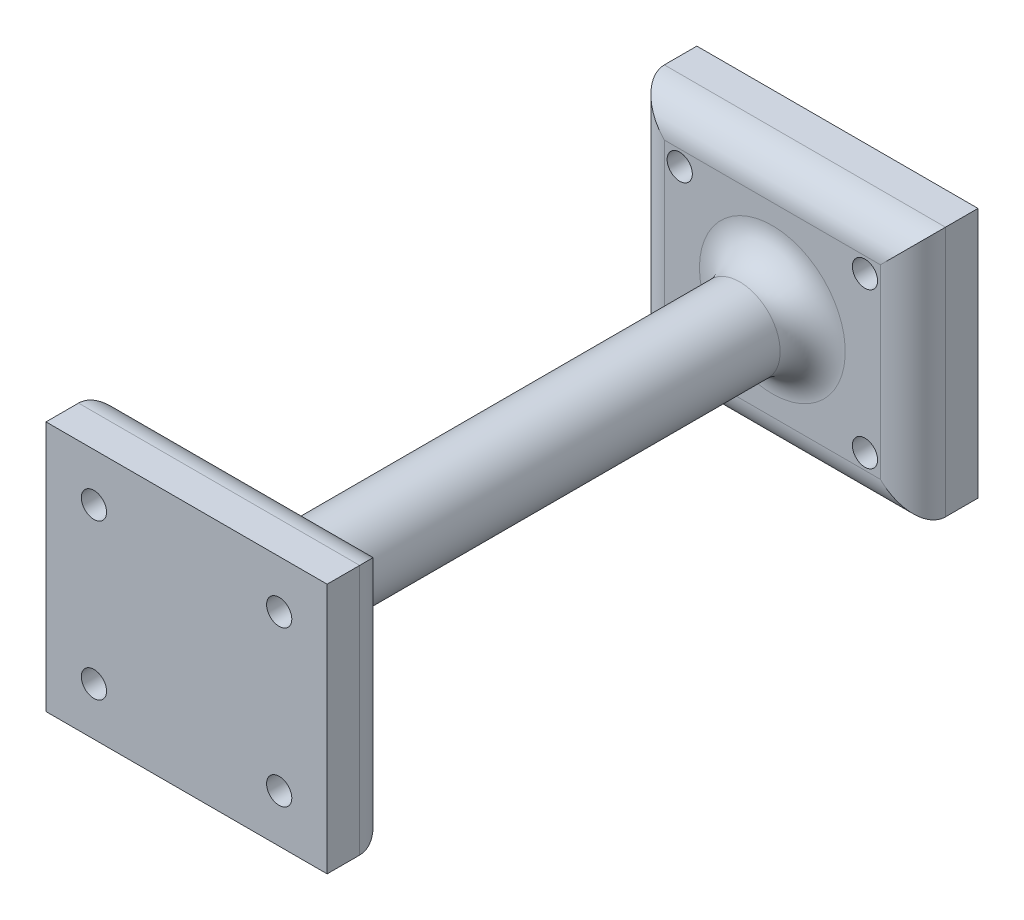
ISO-10303-21;
HEADER;
FILE_DESCRIPTION(('STEP AP214'),'2;1');
FILE_NAME('part.step','',(''),(''),'','','');
FILE_SCHEMA(('AUTOMOTIVE_DESIGN { 1 0 10303 214 1 1 1 1 }'));
ENDSEC;
DATA;
#1=APPLICATION_CONTEXT('core data for automotive mechanical design processes');
#2=APPLICATION_PROTOCOL_DEFINITION('international standard','automotive_design',2000,#1);
#3=PRODUCT_CONTEXT('',#1,'mechanical');
#4=PRODUCT('Part','Part','',(#3));
#5=PRODUCT_RELATED_PRODUCT_CATEGORY('part','',(#4));
#6=PRODUCT_DEFINITION_FORMATION('','',#4);
#7=PRODUCT_DEFINITION_CONTEXT('part definition',#1,'design');
#8=PRODUCT_DEFINITION('design','',#6,#7);
#9=PRODUCT_DEFINITION_SHAPE('','',#8);
#10=(LENGTH_UNIT() NAMED_UNIT(*) SI_UNIT(.MILLI.,.METRE.));
#11=(NAMED_UNIT(*) PLANE_ANGLE_UNIT() SI_UNIT($,.RADIAN.));
#12=(NAMED_UNIT(*) SI_UNIT($,.STERADIAN.) SOLID_ANGLE_UNIT());
#13=UNCERTAINTY_MEASURE_WITH_UNIT(LENGTH_MEASURE(1.E-05),#10,'distance_accuracy_value','');
#14=(GEOMETRIC_REPRESENTATION_CONTEXT(3) GLOBAL_UNCERTAINTY_ASSIGNED_CONTEXT((#13)) GLOBAL_UNIT_ASSIGNED_CONTEXT((#10,
#11,#12)) REPRESENTATION_CONTEXT('',''));
#15=CARTESIAN_POINT('',(0.,0.,0.));
#16=DIRECTION('',(0.,0.,1.));
#17=DIRECTION('',(1.,0.,0.));
#18=AXIS2_PLACEMENT_3D('',#15,#16,#17);
#19=CARTESIAN_POINT('',(-70.1135473442374,-293.286212021238,89.9999999999998));
#20=DIRECTION('',(0.,1.,0.));
#21=DIRECTION('',(0.,0.,1.));
#22=AXIS2_PLACEMENT_3D('',#19,#20,#21);
#23=PLANE('',#22);
#24=DIRECTION('',(0.,0.,1.));
#25=VECTOR('',#24,1.);
#26=CARTESIAN_POINT('',(-113.30674873975,-293.286212021238,90.));
#27=LINE('',#26,#25);
#28=CARTESIAN_POINT('',(-113.30674873975,-293.286212021238,95.));
#29=VERTEX_POINT('',#28);
#30=CARTESIAN_POINT('',(-113.30674873975,-293.286212021238,99.9999999999999));
#31=VERTEX_POINT('',#30);
#32=EDGE_CURVE('E98',#29,#31,#27,.T.);
#33=ORIENTED_EDGE('',*,*,#32,.F.);
#34=DIRECTION('',(-1.,0.,0.));
#35=VECTOR('',#34,1.);
#36=CARTESIAN_POINT('',(-70.1135473442374,-293.286212021238,94.9999999999998));
#37=LINE('',#36,#35);
#38=CARTESIAN_POINT('',(-70.1135473442374,-293.286212021238,94.9999999999998));
#39=VERTEX_POINT('',#38);
#40=EDGE_CURVE('E144',#29,#39,#37,.F.);
#41=ORIENTED_EDGE('',*,*,#40,.T.);
#42=DIRECTION('',(0.,0.,1.));
#43=VECTOR('',#42,1.);
#44=CARTESIAN_POINT('',(-70.1135473442374,-293.286212021238,89.9999999999998));
#45=LINE('',#44,#43);
#46=CARTESIAN_POINT('',(-70.1135473442373,-293.286212021238,99.9999999999998));
#47=VERTEX_POINT('',#46);
#48=EDGE_CURVE('E120',#39,#47,#45,.T.);
#49=ORIENTED_EDGE('',*,*,#48,.T.);
#50=DIRECTION('',(-1.,0.,0.));
#51=VECTOR('',#50,1.);
#52=CARTESIAN_POINT('',(-70.1135473442373,-293.286212021238,99.9999999999998));
#53=LINE('',#52,#51);
#54=EDGE_CURVE('E116',#47,#31,#53,.T.);
#55=ORIENTED_EDGE('',*,*,#54,.T.);
#56=EDGE_LOOP('',(#33,#41,#49,#55));
#57=FACE_BOUND('',#56,.T.);
#58=ADVANCED_FACE('F45',(#57),#23,.F.);
#59=CARTESIAN_POINT('',(-113.30674873975,-293.286212021238,90.));
#60=DIRECTION('',(1.,0.,0.));
#61=DIRECTION('',(0.,0.,-1.));
#62=AXIS2_PLACEMENT_3D('',#59,#60,#61);
#63=PLANE('',#62);
#64=DIRECTION('',(0.,0.,1.));
#65=VECTOR('',#64,1.);
#66=CARTESIAN_POINT('',(-113.30674873975,-254.735493102494,89.9999999999998));
#67=LINE('',#66,#65);
#68=CARTESIAN_POINT('',(-113.30674873975,-254.735493102494,94.9999999999998));
#69=VERTEX_POINT('',#68);
#70=CARTESIAN_POINT('',(-113.30674873975,-254.735493102493,99.9999999999998));
#71=VERTEX_POINT('',#70);
#72=EDGE_CURVE('E110',#69,#71,#67,.T.);
#73=ORIENTED_EDGE('',*,*,#72,.F.);
#74=DIRECTION('',(0.,1.,0.));
#75=VECTOR('',#74,1.);
#76=CARTESIAN_POINT('',(-113.30674873975,-293.286212021238,95.));
#77=LINE('',#76,#75);
#78=EDGE_CURVE('E104',#69,#29,#77,.F.);
#79=ORIENTED_EDGE('',*,*,#78,.T.);
#80=ORIENTED_EDGE('',*,*,#32,.T.);
#81=DIRECTION('',(0.,1.,0.));
#82=VECTOR('',#81,1.);
#83=CARTESIAN_POINT('',(-113.30674873975,-293.286212021238,99.9999999999999));
#84=LINE('',#83,#82);
#85=EDGE_CURVE('E101',#31,#71,#84,.T.);
#86=ORIENTED_EDGE('',*,*,#85,.T.);
#87=EDGE_LOOP('',(#73,#79,#80,#86));
#88=FACE_BOUND('',#87,.T.);
#89=ADVANCED_FACE('F100',(#88),#63,.F.);
#90=CARTESIAN_POINT('',(-113.30674873975,-254.735493102494,89.9999999999998));
#91=DIRECTION('',(0.,-1.,0.));
#92=DIRECTION('',(0.,0.,-1.));
#93=AXIS2_PLACEMENT_3D('',#90,#91,#92);
#94=PLANE('',#93);
#95=DIRECTION('',(0.,0.,1.));
#96=VECTOR('',#95,1.);
#97=CARTESIAN_POINT('',(-70.1135473442374,-254.735493102494,89.9999999999997));
#98=LINE('',#97,#96);
#99=CARTESIAN_POINT('',(-70.1135473442374,-254.735493102494,94.9999999999997));
#100=VERTEX_POINT('',#99);
#101=CARTESIAN_POINT('',(-70.1135473442373,-254.735493102493,99.9999999999997));
#102=VERTEX_POINT('',#101);
#103=EDGE_CURVE('E133',#100,#102,#98,.T.);
#104=ORIENTED_EDGE('',*,*,#103,.F.);
#105=DIRECTION('',(1.,0.,0.));
#106=VECTOR('',#105,1.);
#107=CARTESIAN_POINT('',(-113.30674873975,-254.735493102494,94.9999999999998));
#108=LINE('',#107,#106);
#109=EDGE_CURVE('E54',#100,#69,#108,.F.);
#110=ORIENTED_EDGE('',*,*,#109,.T.);
#111=ORIENTED_EDGE('',*,*,#72,.T.);
#112=DIRECTION('',(1.,0.,0.));
#113=VECTOR('',#112,1.);
#114=CARTESIAN_POINT('',(-113.30674873975,-254.735493102493,99.9999999999998));
#115=LINE('',#114,#113);
#116=EDGE_CURVE('E118',#71,#102,#115,.T.);
#117=ORIENTED_EDGE('',*,*,#116,.T.);
#118=EDGE_LOOP('',(#104,#110,#111,#117));
#119=FACE_BOUND('',#118,.T.);
#120=ADVANCED_FACE('F168',(#119),#94,.F.);
#121=CARTESIAN_POINT('',(-70.1135473442374,-254.735493102494,89.9999999999997));
#122=DIRECTION('',(-1.,0.,0.));
#123=DIRECTION('',(0.,0.,1.));
#124=AXIS2_PLACEMENT_3D('',#121,#122,#123);
#125=PLANE('',#124);
#126=ORIENTED_EDGE('',*,*,#48,.F.);
#127=DIRECTION('',(0.,-1.,0.));
#128=VECTOR('',#127,1.);
#129=CARTESIAN_POINT('',(-70.1135473442374,-254.735493102494,94.9999999999997));
#130=LINE('',#129,#128);
#131=EDGE_CURVE('E12',#39,#100,#130,.F.);
#132=ORIENTED_EDGE('',*,*,#131,.T.);
#133=ORIENTED_EDGE('',*,*,#103,.T.);
#134=DIRECTION('',(0.,-1.,0.));
#135=VECTOR('',#134,1.);
#136=CARTESIAN_POINT('',(-70.1135473442373,-254.735493102493,99.9999999999997));
#137=LINE('',#136,#135);
#138=EDGE_CURVE('E130',#102,#47,#137,.T.);
#139=ORIENTED_EDGE('',*,*,#138,.T.);
#140=EDGE_LOOP('',(#126,#132,#133,#139));
#141=FACE_BOUND('',#140,.T.);
#142=ADVANCED_FACE('F167',(#141),#125,.F.);
#143=CARTESIAN_POINT('',(3.18510403900084E-13,2.89074190639193E-13,89.9999999999986));
#144=DIRECTION('',(0.,0.,-1.));
#145=DIRECTION('',(-1.,0.,0.));
#146=AXIS2_PLACEMENT_3D('',#143,#144,#145);
#147=PLANE('',#146);
#148=CARTESIAN_POINT('',(-77.4795473442374,-285.920212021238,89.9999999999998));
#149=DIRECTION('',(0.,0.,-1.));
#150=DIRECTION('',(-1.,0.,0.));
#151=AXIS2_PLACEMENT_3D('',#148,#149,#150);
#152=CIRCLE('',#151,1.93714318670883);
#153=CARTESIAN_POINT('',(-79.4166905309463,-285.920212021238,89.9999999999998));
#154=VERTEX_POINT('',#153);
#155=EDGE_CURVE('E238',#154,#154,#152,.T.);
#156=ORIENTED_EDGE('',*,*,#155,.F.);
#157=EDGE_LOOP('',(#156));
#158=FACE_BOUND('',#157,.T.);
#159=CARTESIAN_POINT('',(-77.4795473442374,-262.101493102493,89.9999999999997));
#160=DIRECTION('',(0.,0.,-1.));
#161=DIRECTION('',(-1.,0.,0.));
#162=AXIS2_PLACEMENT_3D('',#159,#160,#161);
#163=CIRCLE('',#162,1.93714318670883);
#164=CARTESIAN_POINT('',(-79.4166905309463,-262.101493102493,89.9999999999997));
#165=VERTEX_POINT('',#164);
#166=EDGE_CURVE('E232',#165,#165,#163,.T.);
#167=ORIENTED_EDGE('',*,*,#166,.F.);
#168=EDGE_LOOP('',(#167));
#169=FACE_BOUND('',#168,.T.);
#170=CARTESIAN_POINT('',(-105.940748739749,-262.101493102493,89.9999999999998));
#171=DIRECTION('',(0.,0.,-1.));
#172=DIRECTION('',(-1.,0.,0.));
#173=AXIS2_PLACEMENT_3D('',#170,#171,#172);
#174=CIRCLE('',#173,1.93714318670883);
#175=CARTESIAN_POINT('',(-107.877891926458,-262.101493102493,89.9999999999998));
#176=VERTEX_POINT('',#175);
#177=EDGE_CURVE('E227',#176,#176,#174,.T.);
#178=ORIENTED_EDGE('',*,*,#177,.F.);
#179=EDGE_LOOP('',(#178));
#180=FACE_BOUND('',#179,.T.);
#181=CARTESIAN_POINT('',(-105.940748739749,-285.920212021238,89.9999999999999));
#182=DIRECTION('',(0.,0.,-1.));
#183=DIRECTION('',(-1.,0.,0.));
#184=AXIS2_PLACEMENT_3D('',#181,#182,#183);
#185=CIRCLE('',#184,1.93714318670883);
#186=CARTESIAN_POINT('',(-107.877891926458,-285.920212021238,89.9999999999999));
#187=VERTEX_POINT('',#186);
#188=EDGE_CURVE('E126',#187,#187,#185,.T.);
#189=ORIENTED_EDGE('',*,*,#188,.F.);
#190=EDGE_LOOP('',(#189));
#191=FACE_BOUND('',#190,.T.);
#192=DIRECTION('',(0.,-1.,0.));
#193=VECTOR('',#192,1.);
#194=CARTESIAN_POINT('',(-75.1135473442374,-293.286212021238,89.9999999999998));
#195=LINE('',#194,#193);
#196=CARTESIAN_POINT('',(-75.1135473442374,-259.735493102493,89.9999999999997));
#197=VERTEX_POINT('',#196);
#198=CARTESIAN_POINT('',(-75.1135473442374,-288.286212021238,89.9999999999998));
#199=VERTEX_POINT('',#198);
#200=EDGE_CURVE('E109',#197,#199,#195,.T.);
#201=ORIENTED_EDGE('',*,*,#200,.T.);
#202=DIRECTION('',(-1.,0.,0.));
#203=VECTOR('',#202,1.);
#204=CARTESIAN_POINT('',(-113.30674873975,-288.286212021238,89.9999999999999));
#205=LINE('',#204,#203);
#206=CARTESIAN_POINT('',(-108.30674873975,-288.286212021238,89.9999999999999));
#207=VERTEX_POINT('',#206);
#208=EDGE_CURVE('E141',#199,#207,#205,.T.);
#209=ORIENTED_EDGE('',*,*,#208,.T.);
#210=DIRECTION('',(0.,1.,0.));
#211=VECTOR('',#210,1.);
#212=CARTESIAN_POINT('',(-108.30674873975,-254.735493102494,89.9999999999998));
#213=LINE('',#212,#211);
#214=CARTESIAN_POINT('',(-108.30674873975,-259.735493102493,89.9999999999998));
#215=VERTEX_POINT('',#214);
#216=EDGE_CURVE('E139',#207,#215,#213,.T.);
#217=ORIENTED_EDGE('',*,*,#216,.T.);
#218=DIRECTION('',(1.,0.,0.));
#219=VECTOR('',#218,1.);
#220=CARTESIAN_POINT('',(-70.1135473442374,-259.735493102493,89.9999999999997));
#221=LINE('',#220,#219);
#222=EDGE_CURVE('E137',#215,#197,#221,.T.);
#223=ORIENTED_EDGE('',*,*,#222,.T.);
#224=EDGE_LOOP('',(#201,#209,#217,#223));
#225=FACE_BOUND('',#224,.T.);
#226=ADVANCED_FACE('F162',(#158,#169,#180,#191,#225),#147,.T.);
#227=CARTESIAN_POINT('',(3.53425217288516E-13,3.23989004027625E-13,99.9999999999986));
#228=DIRECTION('',(0.,0.,-1.));
#229=DIRECTION('',(-1.,0.,0.));
#230=AXIS2_PLACEMENT_3D('',#227,#228,#229);
#231=PLANE('',#230);
#232=CARTESIAN_POINT('',(-77.4795473442374,-285.920212021238,99.9999999999998));
#233=DIRECTION('',(0.,0.,-1.));
#234=DIRECTION('',(-1.,0.,0.));
#235=AXIS2_PLACEMENT_3D('',#232,#233,#234);
#236=CIRCLE('',#235,1.93714318670883);
#237=CARTESIAN_POINT('',(-79.4166905309462,-285.920212021238,99.9999999999998));
#238=VERTEX_POINT('',#237);
#239=EDGE_CURVE('E241',#238,#238,#236,.T.);
#240=ORIENTED_EDGE('',*,*,#239,.T.);
#241=EDGE_LOOP('',(#240));
#242=FACE_BOUND('',#241,.T.);
#243=CARTESIAN_POINT('',(-77.4795473442374,-262.101493102493,99.9999999999997));
#244=DIRECTION('',(0.,0.,-1.));
#245=DIRECTION('',(-1.,0.,0.));
#246=AXIS2_PLACEMENT_3D('',#243,#244,#245);
#247=CIRCLE('',#246,1.93714318670883);
#248=CARTESIAN_POINT('',(-79.4166905309462,-262.101493102493,99.9999999999997));
#249=VERTEX_POINT('',#248);
#250=EDGE_CURVE('E235',#249,#249,#247,.T.);
#251=ORIENTED_EDGE('',*,*,#250,.T.);
#252=EDGE_LOOP('',(#251));
#253=FACE_BOUND('',#252,.T.);
#254=CARTESIAN_POINT('',(-105.940748739749,-262.101493102493,99.9999999999998));
#255=DIRECTION('',(0.,0.,-1.));
#256=DIRECTION('',(-1.,0.,0.));
#257=AXIS2_PLACEMENT_3D('',#254,#255,#256);
#258=CIRCLE('',#257,1.93714318670883);
#259=CARTESIAN_POINT('',(-107.877891926458,-262.101493102493,99.9999999999998));
#260=VERTEX_POINT('',#259);
#261=EDGE_CURVE('E224',#260,#260,#258,.T.);
#262=ORIENTED_EDGE('',*,*,#261,.T.);
#263=EDGE_LOOP('',(#262));
#264=FACE_BOUND('',#263,.T.);
#265=CARTESIAN_POINT('',(-105.940748739749,-285.920212021238,99.9999999999999));
#266=DIRECTION('',(0.,0.,-1.));
#267=DIRECTION('',(-1.,0.,0.));
#268=AXIS2_PLACEMENT_3D('',#265,#266,#267);
#269=CIRCLE('',#268,1.93714318670883);
#270=CARTESIAN_POINT('',(-107.877891926458,-285.920212021238,99.9999999999999));
#271=VERTEX_POINT('',#270);
#272=EDGE_CURVE('E229',#271,#271,#269,.T.);
#273=ORIENTED_EDGE('',*,*,#272,.T.);
#274=EDGE_LOOP('',(#273));
#275=FACE_BOUND('',#274,.T.);
#276=ORIENTED_EDGE('',*,*,#54,.F.);
#277=ORIENTED_EDGE('',*,*,#138,.F.);
#278=ORIENTED_EDGE('',*,*,#116,.F.);
#279=ORIENTED_EDGE('',*,*,#85,.F.);
#280=EDGE_LOOP('',(#276,#277,#278,#279));
#281=FACE_BOUND('',#280,.T.);
#282=ADVANCED_FACE('F114',(#242,#253,#264,#275,#281),#231,.F.);
#283=CARTESIAN_POINT('',(3.36181664764513E-13,-259.735493102493,94.9999999999995));
#284=DIRECTION('',(-1.,0.,0.));
#285=DIRECTION('',(0.,0.,1.));
#286=AXIS2_PLACEMENT_3D('',#283,#284,#285);
#287=CYLINDRICAL_SURFACE('',#286,5.);
#288=CARTESIAN_POINT('',(-108.30674873975,-259.735493102493,94.9999999999998));
#289=DIRECTION('',(-0.707106781186547,-0.707106781186547,0.));
#290=DIRECTION('',(-0.707106781186547,0.707106781186547,0.));
#291=AXIS2_PLACEMENT_3D('',#288,#289,#290);
#292=ELLIPSE('',#291,7.07106781186547,5.);
#293=EDGE_CURVE('E124',#69,#215,#292,.T.);
#294=ORIENTED_EDGE('',*,*,#293,.F.);
#295=ORIENTED_EDGE('',*,*,#109,.F.);
#296=CARTESIAN_POINT('',(-75.1135473442374,-259.735493102493,94.9999999999997));
#297=DIRECTION('',(-0.707106781186547,0.707106781186547,0.));
#298=DIRECTION('',(0.707106781186547,0.707106781186547,0.));
#299=AXIS2_PLACEMENT_3D('',#296,#297,#298);
#300=ELLIPSE('',#299,7.07106781186547,5.);
#301=EDGE_CURVE('E49',#197,#100,#300,.F.);
#302=ORIENTED_EDGE('',*,*,#301,.F.);
#303=ORIENTED_EDGE('',*,*,#222,.F.);
#304=EDGE_LOOP('',(#294,#295,#302,#303));
#305=FACE_BOUND('',#304,.T.);
#306=ADVANCED_FACE('F47',(#305),#287,.T.);
#307=CARTESIAN_POINT('',(-75.1135473442374,3.05273640840576E-13,94.9999999999989));
#308=DIRECTION('',(0.,1.,0.));
#309=DIRECTION('',(0.,0.,1.));
#310=AXIS2_PLACEMENT_3D('',#307,#308,#309);
#311=CYLINDRICAL_SURFACE('',#310,5.);
#312=ORIENTED_EDGE('',*,*,#301,.T.);
#313=ORIENTED_EDGE('',*,*,#131,.F.);
#314=CARTESIAN_POINT('',(-75.1135473442374,-288.286212021238,94.9999999999998));
#315=DIRECTION('',(0.707106781186547,0.707106781186547,0.));
#316=DIRECTION('',(-0.707106781186547,0.707106781186547,0.));
#317=AXIS2_PLACEMENT_3D('',#314,#315,#316);
#318=ELLIPSE('',#317,7.07106781186547,5.);
#319=EDGE_CURVE('E150',#199,#39,#318,.F.);
#320=ORIENTED_EDGE('',*,*,#319,.F.);
#321=ORIENTED_EDGE('',*,*,#200,.F.);
#322=EDGE_LOOP('',(#312,#313,#320,#321));
#323=FACE_BOUND('',#322,.T.);
#324=ADVANCED_FACE('F186',(#323),#311,.T.);
#325=CARTESIAN_POINT('',(-108.30674873975,3.05273640840576E-13,94.999999999999));
#326=DIRECTION('',(0.,-1.,0.));
#327=DIRECTION('',(0.,0.,-1.));
#328=AXIS2_PLACEMENT_3D('',#325,#326,#327);
#329=CYLINDRICAL_SURFACE('',#328,5.);
#330=ORIENTED_EDGE('',*,*,#293,.T.);
#331=ORIENTED_EDGE('',*,*,#216,.F.);
#332=CARTESIAN_POINT('',(-108.30674873975,-288.286212021238,94.9999999999999));
#333=DIRECTION('',(0.707106781186547,-0.707106781186547,0.));
#334=DIRECTION('',(-0.707106781186547,-0.707106781186547,0.));
#335=AXIS2_PLACEMENT_3D('',#332,#333,#334);
#336=ELLIPSE('',#335,7.07106781186547,5.);
#337=EDGE_CURVE('E148',#29,#207,#336,.T.);
#338=ORIENTED_EDGE('',*,*,#337,.F.);
#339=ORIENTED_EDGE('',*,*,#78,.F.);
#340=EDGE_LOOP('',(#330,#331,#338,#339));
#341=FACE_BOUND('',#340,.T.);
#342=ADVANCED_FACE('F155',(#341),#329,.T.);
#343=CARTESIAN_POINT('',(3.36181664764514E-13,-288.286212021238,94.9999999999995));
#344=DIRECTION('',(1.,0.,0.));
#345=DIRECTION('',(0.,0.,-1.));
#346=AXIS2_PLACEMENT_3D('',#343,#344,#345);
#347=CYLINDRICAL_SURFACE('',#346,5.);
#348=ORIENTED_EDGE('',*,*,#319,.T.);
#349=ORIENTED_EDGE('',*,*,#40,.F.);
#350=ORIENTED_EDGE('',*,*,#337,.T.);
#351=ORIENTED_EDGE('',*,*,#208,.F.);
#352=EDGE_LOOP('',(#348,#349,#350,#351));
#353=FACE_BOUND('',#352,.T.);
#354=ADVANCED_FACE('F166',(#353),#347,.T.);
#355=CARTESIAN_POINT('',(-105.940748739749,-285.920212021238,84.5209316661954));
#356=DIRECTION('',(0.,0.,1.));
#357=DIRECTION('',(1.,0.,0.));
#358=AXIS2_PLACEMENT_3D('',#355,#356,#357);
#359=CYLINDRICAL_SURFACE('',#358,1.93714318670883);
#360=ORIENTED_EDGE('',*,*,#272,.F.);
#361=EDGE_LOOP('',(#360));
#362=FACE_BOUND('',#361,.T.);
#363=ORIENTED_EDGE('',*,*,#188,.T.);
#364=EDGE_LOOP('',(#363));
#365=FACE_BOUND('',#364,.T.);
#366=ADVANCED_FACE('F184',(#362,#365),#359,.F.);
#367=CARTESIAN_POINT('',(-105.940748739749,-262.101493102493,84.5209316661953));
#368=DIRECTION('',(0.,0.,1.));
#369=DIRECTION('',(1.,0.,0.));
#370=AXIS2_PLACEMENT_3D('',#367,#368,#369);
#371=CYLINDRICAL_SURFACE('',#370,1.93714318670883);
#372=ORIENTED_EDGE('',*,*,#261,.F.);
#373=EDGE_LOOP('',(#372));
#374=FACE_BOUND('',#373,.T.);
#375=ORIENTED_EDGE('',*,*,#177,.T.);
#376=EDGE_LOOP('',(#375));
#377=FACE_BOUND('',#376,.T.);
#378=ADVANCED_FACE('F207',(#374,#377),#371,.F.);
#379=CARTESIAN_POINT('',(-77.4795473442374,-262.101493102493,84.5209316661952));
#380=DIRECTION('',(0.,0.,1.));
#381=DIRECTION('',(1.,0.,0.));
#382=AXIS2_PLACEMENT_3D('',#379,#380,#381);
#383=CYLINDRICAL_SURFACE('',#382,1.93714318670883);
#384=ORIENTED_EDGE('',*,*,#250,.F.);
#385=EDGE_LOOP('',(#384));
#386=FACE_BOUND('',#385,.T.);
#387=ORIENTED_EDGE('',*,*,#166,.T.);
#388=EDGE_LOOP('',(#387));
#389=FACE_BOUND('',#388,.T.);
#390=ADVANCED_FACE('F212',(#386,#389),#383,.F.);
#391=CARTESIAN_POINT('',(-77.4795473442374,-285.920212021238,84.5209316661953));
#392=DIRECTION('',(0.,0.,1.));
#393=DIRECTION('',(1.,0.,0.));
#394=AXIS2_PLACEMENT_3D('',#391,#392,#393);
#395=CYLINDRICAL_SURFACE('',#394,1.93714318670883);
#396=ORIENTED_EDGE('',*,*,#239,.F.);
#397=EDGE_LOOP('',(#396));
#398=FACE_BOUND('',#397,.T.);
#399=ORIENTED_EDGE('',*,*,#155,.T.);
#400=EDGE_LOOP('',(#399));
#401=FACE_BOUND('',#400,.T.);
#402=ADVANCED_FACE('F209',(#398,#401),#395,.F.);
#403=CLOSED_SHELL('',(#58,#89,#120,#142,#226,#282,#306,#324,#342,#354,#366,#378,#390,#402));
#404=MANIFOLD_SOLID_BREP('B2',#403);
#405=CARTESIAN_POINT('',(-113.30674873975,-293.286212021238,10.));
#406=DIRECTION('',(1.,0.,0.));
#407=DIRECTION('',(0.,0.,-1.));
#408=AXIS2_PLACEMENT_3D('',#405,#406,#407);
#409=PLANE('',#408);
#410=DIRECTION('',(0.,0.,-1.));
#411=VECTOR('',#410,1.);
#412=CARTESIAN_POINT('',(-113.30674873975,-293.286212021238,10.));
#413=LINE('',#412,#411);
#414=CARTESIAN_POINT('',(-113.30674873975,-293.286212021238,5.));
#415=VERTEX_POINT('',#414);
#416=CARTESIAN_POINT('',(-113.30674873975,-293.286212021238,0.));
#417=VERTEX_POINT('',#416);
#418=EDGE_CURVE('E387',#415,#417,#413,.T.);
#419=ORIENTED_EDGE('',*,*,#418,.F.);
#420=DIRECTION('',(0.,-1.,0.));
#421=VECTOR('',#420,1.);
#422=CARTESIAN_POINT('',(-113.30674873975,-293.286212021238,5.));
#423=LINE('',#422,#421);
#424=CARTESIAN_POINT('',(-113.30674873975,-254.735493102494,5.));
#425=VERTEX_POINT('',#424);
#426=EDGE_CURVE('E437',#415,#425,#423,.F.);
#427=ORIENTED_EDGE('',*,*,#426,.T.);
#428=DIRECTION('',(0.,0.,-1.));
#429=VECTOR('',#428,1.);
#430=CARTESIAN_POINT('',(-113.30674873975,-254.735493102494,10.));
#431=LINE('',#430,#429);
#432=CARTESIAN_POINT('',(-113.30674873975,-254.735493102494,0.));
#433=VERTEX_POINT('',#432);
#434=EDGE_CURVE('E408',#425,#433,#431,.T.);
#435=ORIENTED_EDGE('',*,*,#434,.T.);
#436=DIRECTION('',(0.,-1.,0.));
#437=VECTOR('',#436,1.);
#438=CARTESIAN_POINT('',(-113.30674873975,-293.286212021238,0.));
#439=LINE('',#438,#437);
#440=EDGE_CURVE('E404',#433,#417,#439,.T.);
#441=ORIENTED_EDGE('',*,*,#440,.T.);
#442=EDGE_LOOP('',(#419,#427,#435,#441));
#443=FACE_BOUND('',#442,.T.);
#444=ADVANCED_FACE('F333',(#443),#409,.F.);
#445=CARTESIAN_POINT('',(-113.30674873975,-293.286212021238,10.));
#446=DIRECTION('',(0.,1.,0.));
#447=DIRECTION('',(0.,0.,1.));
#448=AXIS2_PLACEMENT_3D('',#445,#446,#447);
#449=PLANE('',#448);
#450=DIRECTION('',(0.,0.,-1.));
#451=VECTOR('',#450,1.);
#452=CARTESIAN_POINT('',(-70.1135473442377,-293.286212021238,10.));
#453=LINE('',#452,#451);
#454=CARTESIAN_POINT('',(-70.1135473442377,-293.286212021238,5.));
#455=VERTEX_POINT('',#454);
#456=CARTESIAN_POINT('',(-70.1135473442377,-293.286212021238,0.));
#457=VERTEX_POINT('',#456);
#458=EDGE_CURVE('E398',#455,#457,#453,.T.);
#459=ORIENTED_EDGE('',*,*,#458,.F.);
#460=DIRECTION('',(1.,0.,0.));
#461=VECTOR('',#460,1.);
#462=CARTESIAN_POINT('',(-113.30674873975,-293.286212021238,5.));
#463=LINE('',#462,#461);
#464=EDGE_CURVE('E342',#455,#415,#463,.F.);
#465=ORIENTED_EDGE('',*,*,#464,.T.);
#466=ORIENTED_EDGE('',*,*,#418,.T.);
#467=DIRECTION('',(1.,0.,0.));
#468=VECTOR('',#467,1.);
#469=CARTESIAN_POINT('',(-113.30674873975,-293.286212021238,0.));
#470=LINE('',#469,#468);
#471=EDGE_CURVE('E390',#417,#457,#470,.T.);
#472=ORIENTED_EDGE('',*,*,#471,.T.);
#473=EDGE_LOOP('',(#459,#465,#466,#472));
#474=FACE_BOUND('',#473,.T.);
#475=ADVANCED_FACE('F389',(#474),#449,.F.);
#476=CARTESIAN_POINT('',(-70.1135473442377,-293.286212021238,10.));
#477=DIRECTION('',(-1.,0.,0.));
#478=DIRECTION('',(0.,0.,1.));
#479=AXIS2_PLACEMENT_3D('',#476,#477,#478);
#480=PLANE('',#479);
#481=DIRECTION('',(0.,0.,-1.));
#482=VECTOR('',#481,1.);
#483=CARTESIAN_POINT('',(-70.1135473442377,-254.735493102494,10.));
#484=LINE('',#483,#482);
#485=CARTESIAN_POINT('',(-70.1135473442377,-254.735493102494,5.));
#486=VERTEX_POINT('',#485);
#487=CARTESIAN_POINT('',(-70.1135473442377,-254.735493102494,0.));
#488=VERTEX_POINT('',#487);
#489=EDGE_CURVE('E420',#486,#488,#484,.T.);
#490=ORIENTED_EDGE('',*,*,#489,.F.);
#491=DIRECTION('',(0.,1.,0.));
#492=VECTOR('',#491,1.);
#493=CARTESIAN_POINT('',(-70.1135473442377,-293.286212021238,5.));
#494=LINE('',#493,#492);
#495=EDGE_CURVE('E43',#486,#455,#494,.F.);
#496=ORIENTED_EDGE('',*,*,#495,.T.);
#497=ORIENTED_EDGE('',*,*,#458,.T.);
#498=DIRECTION('',(0.,1.,0.));
#499=VECTOR('',#498,1.);
#500=CARTESIAN_POINT('',(-70.1135473442377,-293.286212021238,0.));
#501=LINE('',#500,#499);
#502=EDGE_CURVE('E406',#457,#488,#501,.T.);
#503=ORIENTED_EDGE('',*,*,#502,.T.);
#504=EDGE_LOOP('',(#490,#496,#497,#503));
#505=FACE_BOUND('',#504,.T.);
#506=ADVANCED_FACE('F464',(#505),#480,.F.);
#507=CARTESIAN_POINT('',(-113.30674873975,-254.735493102494,10.));
#508=DIRECTION('',(0.,-1.,0.));
#509=DIRECTION('',(0.,0.,-1.));
#510=AXIS2_PLACEMENT_3D('',#507,#508,#509);
#511=PLANE('',#510);
#512=ORIENTED_EDGE('',*,*,#434,.F.);
#513=DIRECTION('',(-1.,0.,0.));
#514=VECTOR('',#513,1.);
#515=CARTESIAN_POINT('',(-113.30674873975,-254.735493102494,5.));
#516=LINE('',#515,#514);
#517=EDGE_CURVE('E356',#425,#486,#516,.F.);
#518=ORIENTED_EDGE('',*,*,#517,.T.);
#519=ORIENTED_EDGE('',*,*,#489,.T.);
#520=DIRECTION('',(-1.,0.,0.));
#521=VECTOR('',#520,1.);
#522=CARTESIAN_POINT('',(-113.30674873975,-254.735493102494,0.));
#523=LINE('',#522,#521);
#524=EDGE_CURVE('E417',#488,#433,#523,.T.);
#525=ORIENTED_EDGE('',*,*,#524,.T.);
#526=EDGE_LOOP('',(#512,#518,#519,#525));
#527=FACE_BOUND('',#526,.T.);
#528=ADVANCED_FACE('F463',(#527),#511,.F.);
#529=CARTESIAN_POINT('',(0.,0.,10.));
#530=DIRECTION('',(0.,0.,-1.));
#531=DIRECTION('',(-1.,0.,0.));
#532=AXIS2_PLACEMENT_3D('',#529,#530,#531);
#533=PLANE('',#532);
#534=CARTESIAN_POINT('',(-105.94074873975,-285.920212021238,10.));
#535=DIRECTION('',(0.,0.,1.));
#536=DIRECTION('',(-1.,0.,0.));
#537=AXIS2_PLACEMENT_3D('',#534,#535,#536);
#538=CIRCLE('',#537,1.93714318670883);
#539=CARTESIAN_POINT('',(-107.877891926459,-285.920212021238,10.));
#540=VERTEX_POINT('',#539);
#541=EDGE_CURVE('E619',#540,#540,#538,.T.);
#542=ORIENTED_EDGE('',*,*,#541,.F.);
#543=EDGE_LOOP('',(#542));
#544=FACE_BOUND('',#543,.T.);
#545=CARTESIAN_POINT('',(-77.4795473442377,-262.101493102493,10.));
#546=DIRECTION('',(0.,0.,1.));
#547=DIRECTION('',(-1.,0.,0.));
#548=AXIS2_PLACEMENT_3D('',#545,#546,#547);
#549=CIRCLE('',#548,1.93714318670883);
#550=CARTESIAN_POINT('',(-79.4166905309465,-262.101493102493,10.));
#551=VERTEX_POINT('',#550);
#552=EDGE_CURVE('E631',#551,#551,#549,.T.);
#553=ORIENTED_EDGE('',*,*,#552,.F.);
#554=EDGE_LOOP('',(#553));
#555=FACE_BOUND('',#554,.T.);
#556=CARTESIAN_POINT('',(-105.94074873975,-262.101493102493,10.));
#557=DIRECTION('',(0.,0.,1.));
#558=DIRECTION('',(1.,0.,0.));
#559=AXIS2_PLACEMENT_3D('',#556,#557,#558);
#560=CIRCLE('',#559,1.93714318670883);
#561=CARTESIAN_POINT('',(-104.003605553041,-262.101493102493,10.));
#562=VERTEX_POINT('',#561);
#563=EDGE_CURVE('E647',#562,#562,#560,.T.);
#564=ORIENTED_EDGE('',*,*,#563,.F.);
#565=EDGE_LOOP('',(#564));
#566=FACE_BOUND('',#565,.T.);
#567=CARTESIAN_POINT('',(-77.4795473442377,-285.920212021238,10.));
#568=DIRECTION('',(0.,0.,1.));
#569=DIRECTION('',(1.,0.,0.));
#570=AXIS2_PLACEMENT_3D('',#567,#568,#569);
#571=CIRCLE('',#570,1.93714318670883);
#572=CARTESIAN_POINT('',(-75.5424041575289,-285.920212021238,10.));
#573=VERTEX_POINT('',#572);
#574=EDGE_CURVE('E623',#573,#573,#571,.T.);
#575=ORIENTED_EDGE('',*,*,#574,.F.);
#576=EDGE_LOOP('',(#575));
#577=FACE_BOUND('',#576,.T.);
#578=DIRECTION('',(-1.,0.,0.));
#579=VECTOR('',#578,1.);
#580=CARTESIAN_POINT('',(0.,-259.735493102494,10.));
#581=LINE('',#580,#579);
#582=CARTESIAN_POINT('',(-75.1135473442377,-259.735493102494,10.));
#583=VERTEX_POINT('',#582);
#584=CARTESIAN_POINT('',(-108.30674873975,-259.735493102494,10.));
#585=VERTEX_POINT('',#584);
#586=EDGE_CURVE('E432',#583,#585,#581,.T.);
#587=ORIENTED_EDGE('',*,*,#586,.T.);
#588=DIRECTION('',(0.,-1.,0.));
#589=VECTOR('',#588,1.);
#590=CARTESIAN_POINT('',(-108.30674873975,0.,10.));
#591=LINE('',#590,#589);
#592=CARTESIAN_POINT('',(-108.30674873975,-288.286212021238,10.));
#593=VERTEX_POINT('',#592);
#594=EDGE_CURVE('E434',#585,#593,#591,.T.);
#595=ORIENTED_EDGE('',*,*,#594,.T.);
#596=DIRECTION('',(1.,0.,0.));
#597=VECTOR('',#596,1.);
#598=CARTESIAN_POINT('',(0.,-288.286212021238,10.));
#599=LINE('',#598,#597);
#600=CARTESIAN_POINT('',(-75.1135473442377,-288.286212021238,10.));
#601=VERTEX_POINT('',#600);
#602=EDGE_CURVE('E430',#593,#601,#599,.T.);
#603=ORIENTED_EDGE('',*,*,#602,.T.);
#604=DIRECTION('',(0.,1.,0.));
#605=VECTOR('',#604,1.);
#606=CARTESIAN_POINT('',(-75.1135473442377,0.,10.));
#607=LINE('',#606,#605);
#608=EDGE_CURVE('E428',#601,#583,#607,.T.);
#609=ORIENTED_EDGE('',*,*,#608,.T.);
#610=EDGE_LOOP('',(#587,#595,#603,#609));
#611=FACE_BOUND('',#610,.T.);
#612=CARTESIAN_POINT('',(-91.710148041994,-274.010852561866,10.));
#613=DIRECTION('',(0.,0.,-1.));
#614=DIRECTION('',(-1.,0.,0.));
#615=AXIS2_PLACEMENT_3D('',#612,#613,#614);
#616=CIRCLE('',#615,11.2020023414497);
#617=CARTESIAN_POINT('',(-102.912150383444,-274.010852561866,10.));
#618=VERTEX_POINT('',#617);
#619=EDGE_CURVE('E425',#618,#618,#616,.T.);
#620=ORIENTED_EDGE('',*,*,#619,.T.);
#621=EDGE_LOOP('',(#620));
#622=FACE_BOUND('',#621,.T.);
#623=ADVANCED_FACE('F471',(#544,#555,#566,#577,#611,#622),#533,.F.);
#624=CARTESIAN_POINT('',(0.,0.,0.));
#625=DIRECTION('',(0.,0.,-1.));
#626=DIRECTION('',(-1.,0.,0.));
#627=AXIS2_PLACEMENT_3D('',#624,#625,#626);
#628=PLANE('',#627);
#629=CARTESIAN_POINT('',(-105.94074873975,-285.920212021238,0.));
#630=DIRECTION('',(0.,0.,-1.));
#631=DIRECTION('',(-1.,0.,0.));
#632=AXIS2_PLACEMENT_3D('',#629,#630,#631);
#633=CIRCLE('',#632,1.93714318670883);
#634=CARTESIAN_POINT('',(-107.877891926459,-285.920212021238,0.));
#635=VERTEX_POINT('',#634);
#636=EDGE_CURVE('E622',#635,#635,#633,.F.);
#637=ORIENTED_EDGE('',*,*,#636,.T.);
#638=EDGE_LOOP('',(#637));
#639=FACE_BOUND('',#638,.T.);
#640=CARTESIAN_POINT('',(-77.4795473442377,-262.101493102493,0.));
#641=DIRECTION('',(0.,0.,-1.));
#642=DIRECTION('',(-1.,0.,0.));
#643=AXIS2_PLACEMENT_3D('',#640,#641,#642);
#644=CIRCLE('',#643,1.93714318670883);
#645=CARTESIAN_POINT('',(-79.4166905309465,-262.101493102493,0.));
#646=VERTEX_POINT('',#645);
#647=EDGE_CURVE('E627',#646,#646,#644,.F.);
#648=ORIENTED_EDGE('',*,*,#647,.T.);
#649=EDGE_LOOP('',(#648));
#650=FACE_BOUND('',#649,.T.);
#651=CARTESIAN_POINT('',(-105.94074873975,-262.101493102493,0.));
#652=DIRECTION('',(0.,0.,-1.));
#653=DIRECTION('',(-1.,0.,0.));
#654=AXIS2_PLACEMENT_3D('',#651,#652,#653);
#655=CIRCLE('',#654,1.93714318670883);
#656=CARTESIAN_POINT('',(-107.877891926459,-262.101493102493,0.));
#657=VERTEX_POINT('',#656);
#658=EDGE_CURVE('E634',#657,#657,#655,.F.);
#659=ORIENTED_EDGE('',*,*,#658,.T.);
#660=EDGE_LOOP('',(#659));
#661=FACE_BOUND('',#660,.T.);
#662=CARTESIAN_POINT('',(-77.4795473442377,-285.920212021238,0.));
#663=DIRECTION('',(0.,0.,-1.));
#664=DIRECTION('',(-1.,0.,0.));
#665=AXIS2_PLACEMENT_3D('',#662,#663,#664);
#666=CIRCLE('',#665,1.93714318670883);
#667=CARTESIAN_POINT('',(-79.4166905309465,-285.920212021238,0.));
#668=VERTEX_POINT('',#667);
#669=EDGE_CURVE('E444',#668,#668,#666,.F.);
#670=ORIENTED_EDGE('',*,*,#669,.T.);
#671=EDGE_LOOP('',(#670));
#672=FACE_BOUND('',#671,.T.);
#673=ORIENTED_EDGE('',*,*,#440,.F.);
#674=ORIENTED_EDGE('',*,*,#524,.F.);
#675=ORIENTED_EDGE('',*,*,#502,.F.);
#676=ORIENTED_EDGE('',*,*,#471,.F.);
#677=EDGE_LOOP('',(#673,#674,#675,#676));
#678=FACE_BOUND('',#677,.T.);
#679=ADVANCED_FACE('F402',(#639,#650,#661,#672,#678),#628,.T.);
#680=CARTESIAN_POINT('',(-91.710148041994,-274.010852561866,89.85));
#681=DIRECTION('',(0.,0.,-1.));
#682=DIRECTION('',(-1.,0.,0.));
#683=AXIS2_PLACEMENT_3D('',#680,#681,#682);
#684=CYLINDRICAL_SURFACE('',#683,6.20200234144972);
#685=CARTESIAN_POINT('',(-91.710148041994,-274.010852561866,15.));
#686=DIRECTION('',(0.,0.,-1.));
#687=DIRECTION('',(-1.,0.,0.));
#688=AXIS2_PLACEMENT_3D('',#685,#686,#687);
#689=CIRCLE('',#688,6.20200234144972);
#690=CARTESIAN_POINT('',(-97.9121503834438,-274.010852561866,15.));
#691=VERTEX_POINT('',#690);
#692=EDGE_CURVE('E397',#691,#691,#689,.F.);
#693=ORIENTED_EDGE('',*,*,#692,.T.);
#694=EDGE_LOOP('',(#693));
#695=FACE_BOUND('',#694,.T.);
#696=CARTESIAN_POINT('',(-91.710148041994,-274.010852561866,89.85));
#697=DIRECTION('',(0.,0.,1.));
#698=DIRECTION('',(1.,0.,0.));
#699=AXIS2_PLACEMENT_3D('',#696,#697,#698);
#700=CIRCLE('',#699,6.20200234144972);
#701=CARTESIAN_POINT('',(-85.5081457005443,-274.010852561866,89.85));
#702=VERTEX_POINT('',#701);
#703=EDGE_CURVE('E410',#702,#702,#700,.T.);
#704=ORIENTED_EDGE('',*,*,#703,.F.);
#705=EDGE_LOOP('',(#704));
#706=FACE_BOUND('',#705,.T.);
#707=ADVANCED_FACE('F506',(#695,#706),#684,.T.);
#708=CARTESIAN_POINT('',(-91.710148041994,-274.010852561866,89.85));
#709=DIRECTION('',(0.,0.,1.));
#710=DIRECTION('',(1.,0.,0.));
#711=AXIS2_PLACEMENT_3D('',#708,#709,#710);
#712=PLANE('',#711);
#713=ORIENTED_EDGE('',*,*,#703,.T.);
#714=EDGE_LOOP('',(#713));
#715=FACE_BOUND('',#714,.T.);
#716=ADVANCED_FACE('F482',(#715),#712,.T.);
#717=CARTESIAN_POINT('',(-91.710148041994,-274.010852561866,15.));
#718=DIRECTION('',(0.,0.,-1.));
#719=DIRECTION('',(-1.,0.,0.));
#720=AXIS2_PLACEMENT_3D('',#717,#718,#719);
#721=TOROIDAL_SURFACE('',#720,11.2020023414497,5.);
#722=ORIENTED_EDGE('',*,*,#619,.F.);
#723=EDGE_LOOP('',(#722));
#724=FACE_BOUND('',#723,.T.);
#725=ORIENTED_EDGE('',*,*,#692,.F.);
#726=EDGE_LOOP('',(#725));
#727=FACE_BOUND('',#726,.T.);
#728=ADVANCED_FACE('F479',(#724,#727),#721,.F.);
#729=CARTESIAN_POINT('',(-75.1135473442377,0.,5.));
#730=DIRECTION('',(0.,1.,0.));
#731=DIRECTION('',(0.,0.,1.));
#732=AXIS2_PLACEMENT_3D('',#729,#730,#731);
#733=CYLINDRICAL_SURFACE('',#732,5.);
#734=CARTESIAN_POINT('',(-75.1135473442377,-288.286212021238,5.));
#735=DIRECTION('',(0.707106781186547,0.707106781186547,0.));
#736=DIRECTION('',(-0.707106781186547,0.707106781186547,0.));
#737=AXIS2_PLACEMENT_3D('',#734,#735,#736);
#738=ELLIPSE('',#737,7.07106781186547,5.);
#739=EDGE_CURVE('E445',#455,#601,#738,.F.);
#740=ORIENTED_EDGE('',*,*,#739,.F.);
#741=ORIENTED_EDGE('',*,*,#495,.F.);
#742=CARTESIAN_POINT('',(-75.1135473442377,-259.735493102494,5.));
#743=DIRECTION('',(-0.707106781186547,0.707106781186547,0.));
#744=DIRECTION('',(0.707106781186547,0.707106781186547,0.));
#745=AXIS2_PLACEMENT_3D('',#742,#743,#744);
#746=ELLIPSE('',#745,7.07106781186547,5.);
#747=EDGE_CURVE('E337',#583,#486,#746,.T.);
#748=ORIENTED_EDGE('',*,*,#747,.F.);
#749=ORIENTED_EDGE('',*,*,#608,.F.);
#750=EDGE_LOOP('',(#740,#741,#748,#749));
#751=FACE_BOUND('',#750,.T.);
#752=ADVANCED_FACE('F335',(#751),#733,.T.);
#753=CARTESIAN_POINT('',(0.,-259.735493102494,5.));
#754=DIRECTION('',(-1.,0.,0.));
#755=DIRECTION('',(0.,0.,1.));
#756=AXIS2_PLACEMENT_3D('',#753,#754,#755);
#757=CYLINDRICAL_SURFACE('',#756,5.);
#758=ORIENTED_EDGE('',*,*,#747,.T.);
#759=ORIENTED_EDGE('',*,*,#517,.F.);
#760=CARTESIAN_POINT('',(-108.30674873975,-259.735493102494,5.));
#761=DIRECTION('',(-0.707106781186547,-0.707106781186547,0.));
#762=DIRECTION('',(-0.707106781186547,0.707106781186547,0.));
#763=AXIS2_PLACEMENT_3D('',#760,#761,#762);
#764=ELLIPSE('',#763,7.07106781186547,5.);
#765=EDGE_CURVE('E443',#585,#425,#764,.T.);
#766=ORIENTED_EDGE('',*,*,#765,.F.);
#767=ORIENTED_EDGE('',*,*,#586,.F.);
#768=EDGE_LOOP('',(#758,#759,#766,#767));
#769=FACE_BOUND('',#768,.T.);
#770=ADVANCED_FACE('F454',(#769),#757,.T.);
#771=CARTESIAN_POINT('',(0.,-288.286212021238,5.));
#772=DIRECTION('',(1.,0.,0.));
#773=DIRECTION('',(0.,0.,-1.));
#774=AXIS2_PLACEMENT_3D('',#771,#772,#773);
#775=CYLINDRICAL_SURFACE('',#774,5.);
#776=ORIENTED_EDGE('',*,*,#739,.T.);
#777=ORIENTED_EDGE('',*,*,#602,.F.);
#778=CARTESIAN_POINT('',(-108.30674873975,-288.286212021238,5.));
#779=DIRECTION('',(0.707106781186547,-0.707106781186547,0.));
#780=DIRECTION('',(0.707106781186547,0.707106781186547,0.));
#781=AXIS2_PLACEMENT_3D('',#778,#779,#780);
#782=ELLIPSE('',#781,7.07106781186547,5.);
#783=EDGE_CURVE('E441',#415,#593,#782,.F.);
#784=ORIENTED_EDGE('',*,*,#783,.F.);
#785=ORIENTED_EDGE('',*,*,#464,.F.);
#786=EDGE_LOOP('',(#776,#777,#784,#785));
#787=FACE_BOUND('',#786,.T.);
#788=ADVANCED_FACE('F459',(#787),#775,.T.);
#789=CARTESIAN_POINT('',(-108.30674873975,0.,5.));
#790=DIRECTION('',(0.,-1.,0.));
#791=DIRECTION('',(0.,0.,-1.));
#792=AXIS2_PLACEMENT_3D('',#789,#790,#791);
#793=CYLINDRICAL_SURFACE('',#792,5.);
#794=ORIENTED_EDGE('',*,*,#765,.T.);
#795=ORIENTED_EDGE('',*,*,#426,.F.);
#796=ORIENTED_EDGE('',*,*,#783,.T.);
#797=ORIENTED_EDGE('',*,*,#594,.F.);
#798=EDGE_LOOP('',(#794,#795,#796,#797));
#799=FACE_BOUND('',#798,.T.);
#800=ADVANCED_FACE('F462',(#799),#793,.T.);
#801=CARTESIAN_POINT('',(-77.4795473442377,-285.920212021238,-5.47906833380455));
#802=DIRECTION('',(0.,0.,1.));
#803=DIRECTION('',(1.,0.,0.));
#804=AXIS2_PLACEMENT_3D('',#801,#802,#803);
#805=CYLINDRICAL_SURFACE('',#804,1.93714318670883);
#806=ORIENTED_EDGE('',*,*,#574,.T.);
#807=EDGE_LOOP('',(#806));
#808=FACE_BOUND('',#807,.T.);
#809=ORIENTED_EDGE('',*,*,#669,.F.);
#810=EDGE_LOOP('',(#809));
#811=FACE_BOUND('',#810,.T.);
#812=ADVANCED_FACE('F486',(#808,#811),#805,.F.);
#813=CARTESIAN_POINT('',(-105.94074873975,-262.101493102493,-5.47906833380455));
#814=DIRECTION('',(0.,0.,1.));
#815=DIRECTION('',(1.,0.,0.));
#816=AXIS2_PLACEMENT_3D('',#813,#814,#815);
#817=CYLINDRICAL_SURFACE('',#816,1.93714318670883);
#818=ORIENTED_EDGE('',*,*,#563,.T.);
#819=EDGE_LOOP('',(#818));
#820=FACE_BOUND('',#819,.T.);
#821=ORIENTED_EDGE('',*,*,#658,.F.);
#822=EDGE_LOOP('',(#821));
#823=FACE_BOUND('',#822,.T.);
#824=ADVANCED_FACE('F581',(#820,#823),#817,.F.);
#825=CARTESIAN_POINT('',(-77.4795473442377,-262.101493102493,-5.47906833380455));
#826=DIRECTION('',(0.,0.,1.));
#827=DIRECTION('',(1.,0.,0.));
#828=AXIS2_PLACEMENT_3D('',#825,#826,#827);
#829=CYLINDRICAL_SURFACE('',#828,1.93714318670883);
#830=ORIENTED_EDGE('',*,*,#552,.T.);
#831=EDGE_LOOP('',(#830));
#832=FACE_BOUND('',#831,.T.);
#833=ORIENTED_EDGE('',*,*,#647,.F.);
#834=EDGE_LOOP('',(#833));
#835=FACE_BOUND('',#834,.T.);
#836=ADVANCED_FACE('F590',(#832,#835),#829,.F.);
#837=CARTESIAN_POINT('',(-105.94074873975,-285.920212021238,-5.47906833380455));
#838=DIRECTION('',(0.,0.,1.));
#839=DIRECTION('',(1.,0.,0.));
#840=AXIS2_PLACEMENT_3D('',#837,#838,#839);
#841=CYLINDRICAL_SURFACE('',#840,1.93714318670883);
#842=ORIENTED_EDGE('',*,*,#541,.T.);
#843=EDGE_LOOP('',(#842));
#844=FACE_BOUND('',#843,.T.);
#845=ORIENTED_EDGE('',*,*,#636,.F.);
#846=EDGE_LOOP('',(#845));
#847=FACE_BOUND('',#846,.T.);
#848=ADVANCED_FACE('F599',(#844,#847),#841,.F.);
#849=CLOSED_SHELL('',(#444,#475,#506,#528,#623,#679,#707,#716,#728,#752,#770,#788,#800,#812,
#824,#836,#848));
#850=MANIFOLD_SOLID_BREP('B6',#849);
#851=ADVANCED_BREP_SHAPE_REPRESENTATION('',(#18,#404,#850),#14);
#852=SHAPE_DEFINITION_REPRESENTATION(#9,#851);
ENDSEC;
END-ISO-10303-21;
